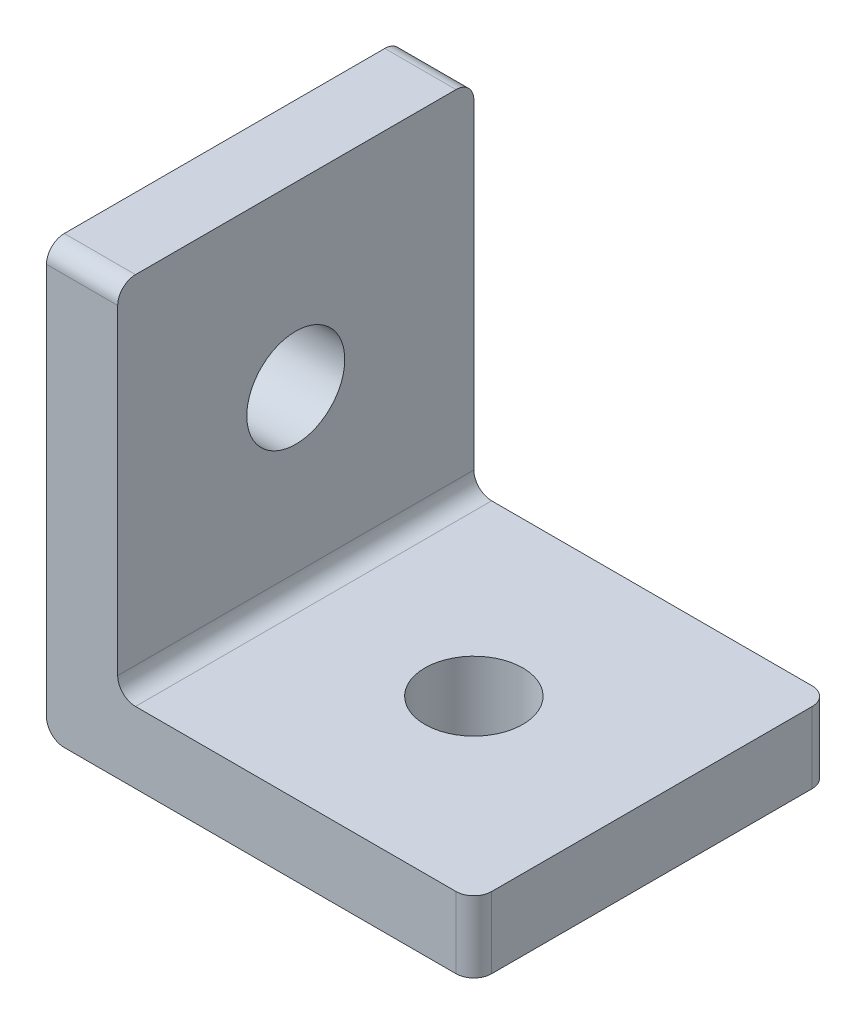
ISO-10303-21;
HEADER;
FILE_DESCRIPTION(('STEP AP214'),'2;1');
FILE_NAME('part.step','',(''),(''),'','','');
FILE_SCHEMA(('AUTOMOTIVE_DESIGN { 1 0 10303 214 1 1 1 1 }'));
ENDSEC;
DATA;
#1=APPLICATION_CONTEXT('core data for automotive mechanical design processes');
#2=APPLICATION_PROTOCOL_DEFINITION('international standard','automotive_design',2000,#1);
#3=PRODUCT_CONTEXT('',#1,'mechanical');
#4=PRODUCT('Part','Part','',(#3));
#5=PRODUCT_RELATED_PRODUCT_CATEGORY('part','',(#4));
#6=PRODUCT_DEFINITION_FORMATION('','',#4);
#7=PRODUCT_DEFINITION_CONTEXT('part definition',#1,'design');
#8=PRODUCT_DEFINITION('design','',#6,#7);
#9=PRODUCT_DEFINITION_SHAPE('','',#8);
#10=(LENGTH_UNIT() NAMED_UNIT(*) SI_UNIT(.MILLI.,.METRE.));
#11=(NAMED_UNIT(*) PLANE_ANGLE_UNIT() SI_UNIT($,.RADIAN.));
#12=(NAMED_UNIT(*) SI_UNIT($,.STERADIAN.) SOLID_ANGLE_UNIT());
#13=UNCERTAINTY_MEASURE_WITH_UNIT(LENGTH_MEASURE(1.E-05),#10,'distance_accuracy_value','');
#14=(GEOMETRIC_REPRESENTATION_CONTEXT(3) GLOBAL_UNCERTAINTY_ASSIGNED_CONTEXT((#13)) GLOBAL_UNIT_ASSIGNED_CONTEXT((#10,
#11,#12)) REPRESENTATION_CONTEXT('',''));
#15=CARTESIAN_POINT('',(0.,0.,0.));
#16=DIRECTION('',(0.,0.,1.));
#17=DIRECTION('',(1.,0.,0.));
#18=AXIS2_PLACEMENT_3D('',#15,#16,#17);
#19=CARTESIAN_POINT('',(24.,0.,20.));
#20=DIRECTION('',(1.,0.,0.));
#21=DIRECTION('',(0.,1.,0.));
#22=AXIS2_PLACEMENT_3D('',#19,#20,#21);
#23=PLANE('',#22);
#24=DIRECTION('',(0.,0.,-1.));
#25=VECTOR('',#24,1.);
#26=CARTESIAN_POINT('',(24.,-3.99999999999997,20.));
#27=LINE('',#26,#25);
#28=CARTESIAN_POINT('',(24.,-3.99999999999997,19.));
#29=VERTEX_POINT('',#28);
#30=CARTESIAN_POINT('',(24.,-3.99999999999997,1.));
#31=VERTEX_POINT('',#30);
#32=EDGE_CURVE('E152',#29,#31,#27,.T.);
#33=ORIENTED_EDGE('',*,*,#32,.T.);
#34=DIRECTION('',(0.,-1.,0.));
#35=VECTOR('',#34,1.);
#36=CARTESIAN_POINT('',(24.,0.,1.));
#37=LINE('',#36,#35);
#38=CARTESIAN_POINT('',(24.,0.,1.));
#39=VERTEX_POINT('',#38);
#40=EDGE_CURVE('E54',#31,#39,#37,.F.);
#41=ORIENTED_EDGE('',*,*,#40,.T.);
#42=DIRECTION('',(0.,0.,-1.));
#43=VECTOR('',#42,1.);
#44=CARTESIAN_POINT('',(24.,0.,20.));
#45=LINE('',#44,#43);
#46=CARTESIAN_POINT('',(24.,0.,19.));
#47=VERTEX_POINT('',#46);
#48=EDGE_CURVE('E161',#47,#39,#45,.T.);
#49=ORIENTED_EDGE('',*,*,#48,.F.);
#50=DIRECTION('',(0.,-1.,0.));
#51=VECTOR('',#50,1.);
#52=CARTESIAN_POINT('',(24.,0.,19.));
#53=LINE('',#52,#51);
#54=EDGE_CURVE('E190',#47,#29,#53,.T.);
#55=ORIENTED_EDGE('',*,*,#54,.T.);
#56=EDGE_LOOP('',(#33,#41,#49,#55));
#57=FACE_BOUND('',#56,.T.);
#58=ADVANCED_FACE('F39',(#57),#23,.T.);
#59=CARTESIAN_POINT('',(0.,0.,20.));
#60=DIRECTION('',(0.,1.,0.));
#61=DIRECTION('',(-1.,0.,0.));
#62=AXIS2_PLACEMENT_3D('',#59,#60,#61);
#63=PLANE('',#62);
#64=CARTESIAN_POINT('',(14.,0.,10.));
#65=DIRECTION('',(0.,1.,0.));
#66=DIRECTION('',(-1.,0.,0.));
#67=AXIS2_PLACEMENT_3D('',#64,#65,#66);
#68=CIRCLE('',#67,2.75);
#69=CARTESIAN_POINT('',(11.25,0.,10.));
#70=VERTEX_POINT('',#69);
#71=EDGE_CURVE('E245',#70,#70,#68,.T.);
#72=ORIENTED_EDGE('',*,*,#71,.F.);
#73=EDGE_LOOP('',(#72));
#74=FACE_BOUND('',#73,.T.);
#75=ORIENTED_EDGE('',*,*,#48,.T.);
#76=CARTESIAN_POINT('',(23.,0.,1.));
#77=DIRECTION('',(0.,1.,0.));
#78=DIRECTION('',(-1.,0.,0.));
#79=AXIS2_PLACEMENT_3D('',#76,#77,#78);
#80=CIRCLE('',#79,1.);
#81=CARTESIAN_POINT('',(23.,0.,0.));
#82=VERTEX_POINT('',#81);
#83=EDGE_CURVE('E197',#39,#82,#80,.T.);
#84=ORIENTED_EDGE('',*,*,#83,.T.);
#85=DIRECTION('',(1.,0.,0.));
#86=VECTOR('',#85,1.);
#87=CARTESIAN_POINT('',(0.,0.,0.));
#88=LINE('',#87,#86);
#89=CARTESIAN_POINT('',(5.,0.,0.));
#90=VERTEX_POINT('',#89);
#91=EDGE_CURVE('E204',#90,#82,#88,.T.);
#92=ORIENTED_EDGE('',*,*,#91,.F.);
#93=DIRECTION('',(0.,0.,-1.));
#94=VECTOR('',#93,1.);
#95=CARTESIAN_POINT('',(5.,0.,20.));
#96=LINE('',#95,#94);
#97=CARTESIAN_POINT('',(5.,0.,20.));
#98=VERTEX_POINT('',#97);
#99=EDGE_CURVE('E194',#90,#98,#96,.F.);
#100=ORIENTED_EDGE('',*,*,#99,.T.);
#101=DIRECTION('',(1.,0.,0.));
#102=VECTOR('',#101,1.);
#103=CARTESIAN_POINT('',(0.,0.,20.));
#104=LINE('',#103,#102);
#105=CARTESIAN_POINT('',(23.,0.,20.));
#106=VERTEX_POINT('',#105);
#107=EDGE_CURVE('E223',#98,#106,#104,.T.);
#108=ORIENTED_EDGE('',*,*,#107,.T.);
#109=CARTESIAN_POINT('',(23.,0.,19.));
#110=DIRECTION('',(0.,1.,0.));
#111=DIRECTION('',(-1.,0.,0.));
#112=AXIS2_PLACEMENT_3D('',#109,#110,#111);
#113=CIRCLE('',#112,1.);
#114=EDGE_CURVE('E61',#106,#47,#113,.T.);
#115=ORIENTED_EDGE('',*,*,#114,.T.);
#116=EDGE_LOOP('',(#75,#84,#92,#100,#108,#115));
#117=FACE_BOUND('',#116,.T.);
#118=ADVANCED_FACE('F211',(#74,#117),#63,.T.);
#119=CARTESIAN_POINT('',(4.,0.,20.));
#120=DIRECTION('',(-1.,0.,0.));
#121=DIRECTION('',(0.,-1.,0.));
#122=AXIS2_PLACEMENT_3D('',#119,#120,#121);
#123=PLANE('',#122);
#124=CARTESIAN_POINT('',(4.,10.,10.));
#125=DIRECTION('',(1.,0.,0.));
#126=DIRECTION('',(0.,1.,0.));
#127=AXIS2_PLACEMENT_3D('',#124,#125,#126);
#128=CIRCLE('',#127,2.75);
#129=CARTESIAN_POINT('',(4.,12.75,10.));
#130=VERTEX_POINT('',#129);
#131=EDGE_CURVE('E248',#130,#130,#128,.T.);
#132=ORIENTED_EDGE('',*,*,#131,.F.);
#133=EDGE_LOOP('',(#132));
#134=FACE_BOUND('',#133,.T.);
#135=DIRECTION('',(0.,0.,-1.));
#136=VECTOR('',#135,1.);
#137=CARTESIAN_POINT('',(4.,20.,20.));
#138=LINE('',#137,#136);
#139=CARTESIAN_POINT('',(4.,20.,19.));
#140=VERTEX_POINT('',#139);
#141=CARTESIAN_POINT('',(4.,20.,1.));
#142=VERTEX_POINT('',#141);
#143=EDGE_CURVE('E151',#140,#142,#138,.T.);
#144=ORIENTED_EDGE('',*,*,#143,.F.);
#145=CARTESIAN_POINT('',(4.,19.,19.));
#146=DIRECTION('',(-1.,0.,0.));
#147=DIRECTION('',(0.,-1.,0.));
#148=AXIS2_PLACEMENT_3D('',#145,#146,#147);
#149=CIRCLE('',#148,1.);
#150=CARTESIAN_POINT('',(4.,19.,20.));
#151=VERTEX_POINT('',#150);
#152=EDGE_CURVE('E155',#140,#151,#149,.F.);
#153=ORIENTED_EDGE('',*,*,#152,.T.);
#154=DIRECTION('',(0.,1.,0.));
#155=VECTOR('',#154,1.);
#156=CARTESIAN_POINT('',(4.,0.,20.));
#157=LINE('',#156,#155);
#158=CARTESIAN_POINT('',(4.,1.00000000000001,20.));
#159=VERTEX_POINT('',#158);
#160=EDGE_CURVE('E222',#159,#151,#157,.T.);
#161=ORIENTED_EDGE('',*,*,#160,.F.);
#162=DIRECTION('',(0.,0.,-1.));
#163=VECTOR('',#162,1.);
#164=CARTESIAN_POINT('',(4.,1.00000000000001,20.));
#165=LINE('',#164,#163);
#166=CARTESIAN_POINT('',(4.,1.00000000000001,0.));
#167=VERTEX_POINT('',#166);
#168=EDGE_CURVE('E156',#159,#167,#165,.T.);
#169=ORIENTED_EDGE('',*,*,#168,.T.);
#170=DIRECTION('',(0.,1.,0.));
#171=VECTOR('',#170,1.);
#172=CARTESIAN_POINT('',(4.,0.,0.));
#173=LINE('',#172,#171);
#174=CARTESIAN_POINT('',(4.,19.,0.));
#175=VERTEX_POINT('',#174);
#176=EDGE_CURVE('E207',#167,#175,#173,.T.);
#177=ORIENTED_EDGE('',*,*,#176,.T.);
#178=CARTESIAN_POINT('',(4.,19.,1.));
#179=DIRECTION('',(-1.,0.,0.));
#180=DIRECTION('',(0.,-1.,0.));
#181=AXIS2_PLACEMENT_3D('',#178,#179,#180);
#182=CIRCLE('',#181,1.);
#183=EDGE_CURVE('E159',#175,#142,#182,.F.);
#184=ORIENTED_EDGE('',*,*,#183,.T.);
#185=EDGE_LOOP('',(#144,#153,#161,#169,#177,#184));
#186=FACE_BOUND('',#185,.T.);
#187=ADVANCED_FACE('F225',(#134,#186),#123,.F.);
#188=CARTESIAN_POINT('',(0.,20.,20.));
#189=DIRECTION('',(0.,1.,0.));
#190=DIRECTION('',(0.,0.,1.));
#191=AXIS2_PLACEMENT_3D('',#188,#189,#190);
#192=PLANE('',#191);
#193=DIRECTION('',(0.,0.,-1.));
#194=VECTOR('',#193,1.);
#195=CARTESIAN_POINT('',(0.,20.,20.));
#196=LINE('',#195,#194);
#197=CARTESIAN_POINT('',(0.,20.,19.));
#198=VERTEX_POINT('',#197);
#199=CARTESIAN_POINT('',(0.,20.,1.));
#200=VERTEX_POINT('',#199);
#201=EDGE_CURVE('E133',#198,#200,#196,.T.);
#202=ORIENTED_EDGE('',*,*,#201,.F.);
#203=DIRECTION('',(1.,0.,0.));
#204=VECTOR('',#203,1.);
#205=CARTESIAN_POINT('',(0.,20.,19.));
#206=LINE('',#205,#204);
#207=EDGE_CURVE('E147',#198,#140,#206,.T.);
#208=ORIENTED_EDGE('',*,*,#207,.T.);
#209=ORIENTED_EDGE('',*,*,#143,.T.);
#210=DIRECTION('',(1.,0.,0.));
#211=VECTOR('',#210,1.);
#212=CARTESIAN_POINT('',(0.,20.,1.));
#213=LINE('',#212,#211);
#214=EDGE_CURVE('E150',#142,#200,#213,.F.);
#215=ORIENTED_EDGE('',*,*,#214,.T.);
#216=EDGE_LOOP('',(#202,#208,#209,#215));
#217=FACE_BOUND('',#216,.T.);
#218=ADVANCED_FACE('F145',(#217),#192,.T.);
#219=CARTESIAN_POINT('',(0.,0.,20.));
#220=DIRECTION('',(1.,0.,0.));
#221=DIRECTION('',(0.,1.,0.));
#222=AXIS2_PLACEMENT_3D('',#219,#220,#221);
#223=PLANE('',#222);
#224=CARTESIAN_POINT('',(0.,10.,10.));
#225=DIRECTION('',(1.,0.,0.));
#226=DIRECTION('',(0.,1.,0.));
#227=AXIS2_PLACEMENT_3D('',#224,#225,#226);
#228=CIRCLE('',#227,2.75);
#229=CARTESIAN_POINT('',(0.,12.75,10.));
#230=VERTEX_POINT('',#229);
#231=EDGE_CURVE('E246',#230,#230,#228,.T.);
#232=ORIENTED_EDGE('',*,*,#231,.T.);
#233=EDGE_LOOP('',(#232));
#234=FACE_BOUND('',#233,.T.);
#235=DIRECTION('',(0.,-1.,0.));
#236=VECTOR('',#235,1.);
#237=CARTESIAN_POINT('',(0.,0.,20.));
#238=LINE('',#237,#236);
#239=CARTESIAN_POINT('',(0.,19.,20.));
#240=VERTEX_POINT('',#239);
#241=CARTESIAN_POINT('',(0.,-3.,20.));
#242=VERTEX_POINT('',#241);
#243=EDGE_CURVE('E136',#240,#242,#238,.T.);
#244=ORIENTED_EDGE('',*,*,#243,.F.);
#245=CARTESIAN_POINT('',(0.,19.,19.));
#246=DIRECTION('',(1.,0.,0.));
#247=DIRECTION('',(0.,1.,0.));
#248=AXIS2_PLACEMENT_3D('',#245,#246,#247);
#249=CIRCLE('',#248,1.);
#250=EDGE_CURVE('E130',#240,#198,#249,.F.);
#251=ORIENTED_EDGE('',*,*,#250,.T.);
#252=ORIENTED_EDGE('',*,*,#201,.T.);
#253=CARTESIAN_POINT('',(0.,19.,1.));
#254=DIRECTION('',(1.,0.,0.));
#255=DIRECTION('',(0.,1.,0.));
#256=AXIS2_PLACEMENT_3D('',#253,#254,#255);
#257=CIRCLE('',#256,1.);
#258=CARTESIAN_POINT('',(0.,19.,0.));
#259=VERTEX_POINT('',#258);
#260=EDGE_CURVE('E141',#200,#259,#257,.F.);
#261=ORIENTED_EDGE('',*,*,#260,.T.);
#262=DIRECTION('',(0.,-1.,0.));
#263=VECTOR('',#262,1.);
#264=CARTESIAN_POINT('',(0.,0.,0.));
#265=LINE('',#264,#263);
#266=CARTESIAN_POINT('',(0.,-3.,0.));
#267=VERTEX_POINT('',#266);
#268=EDGE_CURVE('E236',#259,#267,#265,.T.);
#269=ORIENTED_EDGE('',*,*,#268,.T.);
#270=DIRECTION('',(0.,0.,-1.));
#271=VECTOR('',#270,1.);
#272=CARTESIAN_POINT('',(0.,-3.,20.));
#273=LINE('',#272,#271);
#274=EDGE_CURVE('E173',#267,#242,#273,.F.);
#275=ORIENTED_EDGE('',*,*,#274,.T.);
#276=EDGE_LOOP('',(#244,#251,#252,#261,#269,#275));
#277=FACE_BOUND('',#276,.T.);
#278=ADVANCED_FACE('F132',(#234,#277),#223,.F.);
#279=CARTESIAN_POINT('',(0.,-4.,20.));
#280=DIRECTION('',(0.,1.,0.));
#281=DIRECTION('',(-1.,0.,0.));
#282=AXIS2_PLACEMENT_3D('',#279,#280,#281);
#283=PLANE('',#282);
#284=CARTESIAN_POINT('',(14.,-3.99999999999998,10.));
#285=DIRECTION('',(0.,1.,0.));
#286=DIRECTION('',(-1.,0.,0.));
#287=AXIS2_PLACEMENT_3D('',#284,#285,#286);
#288=CIRCLE('',#287,2.75);
#289=CARTESIAN_POINT('',(11.25,-3.99999999999999,10.));
#290=VERTEX_POINT('',#289);
#291=EDGE_CURVE('E214',#290,#290,#288,.T.);
#292=ORIENTED_EDGE('',*,*,#291,.T.);
#293=EDGE_LOOP('',(#292));
#294=FACE_BOUND('',#293,.T.);
#295=DIRECTION('',(1.,0.,0.));
#296=VECTOR('',#295,1.);
#297=CARTESIAN_POINT('',(0.,-4.,0.));
#298=LINE('',#297,#296);
#299=CARTESIAN_POINT('',(1.,-4.,0.));
#300=VERTEX_POINT('',#299);
#301=CARTESIAN_POINT('',(23.,-3.99999999999997,0.));
#302=VERTEX_POINT('',#301);
#303=EDGE_CURVE('E229',#300,#302,#298,.T.);
#304=ORIENTED_EDGE('',*,*,#303,.T.);
#305=CARTESIAN_POINT('',(23.,-3.99999999999997,1.));
#306=DIRECTION('',(0.,1.,0.));
#307=DIRECTION('',(-1.,0.,0.));
#308=AXIS2_PLACEMENT_3D('',#305,#306,#307);
#309=CIRCLE('',#308,1.);
#310=EDGE_CURVE('E188',#302,#31,#309,.F.);
#311=ORIENTED_EDGE('',*,*,#310,.T.);
#312=ORIENTED_EDGE('',*,*,#32,.F.);
#313=CARTESIAN_POINT('',(23.,-3.99999999999997,19.));
#314=DIRECTION('',(0.,1.,0.));
#315=DIRECTION('',(-1.,0.,0.));
#316=AXIS2_PLACEMENT_3D('',#313,#314,#315);
#317=CIRCLE('',#316,1.);
#318=CARTESIAN_POINT('',(23.,-3.99999999999997,20.));
#319=VERTEX_POINT('',#318);
#320=EDGE_CURVE('E186',#29,#319,#317,.F.);
#321=ORIENTED_EDGE('',*,*,#320,.T.);
#322=DIRECTION('',(1.,0.,0.));
#323=VECTOR('',#322,1.);
#324=CARTESIAN_POINT('',(0.,-4.,20.));
#325=LINE('',#324,#323);
#326=CARTESIAN_POINT('',(1.,-4.,20.));
#327=VERTEX_POINT('',#326);
#328=EDGE_CURVE('E227',#327,#319,#325,.T.);
#329=ORIENTED_EDGE('',*,*,#328,.F.);
#330=DIRECTION('',(0.,0.,-1.));
#331=VECTOR('',#330,1.);
#332=CARTESIAN_POINT('',(1.,-4.,20.));
#333=LINE('',#332,#331);
#334=EDGE_CURVE('E183',#327,#300,#333,.T.);
#335=ORIENTED_EDGE('',*,*,#334,.T.);
#336=EDGE_LOOP('',(#304,#311,#312,#321,#329,#335));
#337=FACE_BOUND('',#336,.T.);
#338=ADVANCED_FACE('F299',(#294,#337),#283,.F.);
#339=CARTESIAN_POINT('',(0.,0.,20.));
#340=DIRECTION('',(0.,0.,1.));
#341=DIRECTION('',(1.,0.,0.));
#342=AXIS2_PLACEMENT_3D('',#339,#340,#341);
#343=PLANE('',#342);
#344=ORIENTED_EDGE('',*,*,#160,.T.);
#345=DIRECTION('',(1.,0.,0.));
#346=VECTOR('',#345,1.);
#347=CARTESIAN_POINT('',(0.,19.,20.));
#348=LINE('',#347,#346);
#349=EDGE_CURVE('E171',#151,#240,#348,.F.);
#350=ORIENTED_EDGE('',*,*,#349,.T.);
#351=ORIENTED_EDGE('',*,*,#243,.T.);
#352=CARTESIAN_POINT('',(1.,-3.,20.));
#353=DIRECTION('',(0.,0.,1.));
#354=DIRECTION('',(1.,0.,0.));
#355=AXIS2_PLACEMENT_3D('',#352,#353,#354);
#356=CIRCLE('',#355,1.);
#357=EDGE_CURVE('E167',#242,#327,#356,.T.);
#358=ORIENTED_EDGE('',*,*,#357,.T.);
#359=ORIENTED_EDGE('',*,*,#328,.T.);
#360=DIRECTION('',(0.,-1.,0.));
#361=VECTOR('',#360,1.);
#362=CARTESIAN_POINT('',(23.,0.,20.));
#363=LINE('',#362,#361);
#364=EDGE_CURVE('E169',#319,#106,#363,.F.);
#365=ORIENTED_EDGE('',*,*,#364,.T.);
#366=ORIENTED_EDGE('',*,*,#107,.F.);
#367=CARTESIAN_POINT('',(5.,1.00000000000001,20.));
#368=DIRECTION('',(0.,0.,1.));
#369=DIRECTION('',(1.,0.,0.));
#370=AXIS2_PLACEMENT_3D('',#367,#368,#369);
#371=CIRCLE('',#370,1.);
#372=EDGE_CURVE('E11',#98,#159,#371,.F.);
#373=ORIENTED_EDGE('',*,*,#372,.T.);
#374=EDGE_LOOP('',(#344,#350,#351,#358,#359,#365,#366,#373));
#375=FACE_BOUND('',#374,.T.);
#376=ADVANCED_FACE('F221',(#375),#343,.T.);
#377=CARTESIAN_POINT('',(0.,0.,0.));
#378=DIRECTION('',(0.,0.,1.));
#379=DIRECTION('',(1.,0.,0.));
#380=AXIS2_PLACEMENT_3D('',#377,#378,#379);
#381=PLANE('',#380);
#382=ORIENTED_EDGE('',*,*,#268,.F.);
#383=DIRECTION('',(1.,0.,0.));
#384=VECTOR('',#383,1.);
#385=CARTESIAN_POINT('',(4.,19.,0.));
#386=LINE('',#385,#384);
#387=EDGE_CURVE('E180',#259,#175,#386,.T.);
#388=ORIENTED_EDGE('',*,*,#387,.T.);
#389=ORIENTED_EDGE('',*,*,#176,.F.);
#390=CARTESIAN_POINT('',(5.,1.00000000000001,0.));
#391=DIRECTION('',(0.,0.,1.));
#392=DIRECTION('',(1.,0.,0.));
#393=AXIS2_PLACEMENT_3D('',#390,#391,#392);
#394=CIRCLE('',#393,1.);
#395=EDGE_CURVE('E47',#167,#90,#394,.T.);
#396=ORIENTED_EDGE('',*,*,#395,.T.);
#397=ORIENTED_EDGE('',*,*,#91,.T.);
#398=DIRECTION('',(0.,-1.,0.));
#399=VECTOR('',#398,1.);
#400=CARTESIAN_POINT('',(23.,-3.99999999999997,0.));
#401=LINE('',#400,#399);
#402=EDGE_CURVE('E177',#82,#302,#401,.T.);
#403=ORIENTED_EDGE('',*,*,#402,.T.);
#404=ORIENTED_EDGE('',*,*,#303,.F.);
#405=CARTESIAN_POINT('',(1.,-3.,0.));
#406=DIRECTION('',(0.,0.,1.));
#407=DIRECTION('',(1.,0.,0.));
#408=AXIS2_PLACEMENT_3D('',#405,#406,#407);
#409=CIRCLE('',#408,1.);
#410=EDGE_CURVE('E140',#300,#267,#409,.F.);
#411=ORIENTED_EDGE('',*,*,#410,.T.);
#412=EDGE_LOOP('',(#382,#388,#389,#396,#397,#403,#404,#411));
#413=FACE_BOUND('',#412,.T.);
#414=ADVANCED_FACE('F203',(#413),#381,.F.);
#415=CARTESIAN_POINT('',(14.,-20.,10.));
#416=DIRECTION('',(0.,1.,0.));
#417=DIRECTION('',(-1.,0.,0.));
#418=AXIS2_PLACEMENT_3D('',#415,#416,#417);
#419=CYLINDRICAL_SURFACE('',#418,2.75);
#420=ORIENTED_EDGE('',*,*,#71,.T.);
#421=EDGE_LOOP('',(#420));
#422=FACE_BOUND('',#421,.T.);
#423=ORIENTED_EDGE('',*,*,#291,.F.);
#424=EDGE_LOOP('',(#423));
#425=FACE_BOUND('',#424,.T.);
#426=ADVANCED_FACE('F315',(#422,#425),#419,.F.);
#427=CARTESIAN_POINT('',(-16.,10.,10.));
#428=DIRECTION('',(1.,0.,0.));
#429=DIRECTION('',(0.,1.,0.));
#430=AXIS2_PLACEMENT_3D('',#427,#428,#429);
#431=CYLINDRICAL_SURFACE('',#430,2.75);
#432=ORIENTED_EDGE('',*,*,#131,.T.);
#433=EDGE_LOOP('',(#432));
#434=FACE_BOUND('',#433,.T.);
#435=ORIENTED_EDGE('',*,*,#231,.F.);
#436=EDGE_LOOP('',(#435));
#437=FACE_BOUND('',#436,.T.);
#438=ADVANCED_FACE('F256',(#434,#437),#431,.F.);
#439=CARTESIAN_POINT('',(0.,19.,19.));
#440=DIRECTION('',(1.,0.,0.));
#441=DIRECTION('',(0.,0.,-1.));
#442=AXIS2_PLACEMENT_3D('',#439,#440,#441);
#443=CYLINDRICAL_SURFACE('',#442,1.);
#444=ORIENTED_EDGE('',*,*,#250,.F.);
#445=ORIENTED_EDGE('',*,*,#349,.F.);
#446=ORIENTED_EDGE('',*,*,#152,.F.);
#447=ORIENTED_EDGE('',*,*,#207,.F.);
#448=EDGE_LOOP('',(#444,#445,#446,#447));
#449=FACE_BOUND('',#448,.T.);
#450=ADVANCED_FACE('F154',(#449),#443,.T.);
#451=CARTESIAN_POINT('',(0.,19.,1.));
#452=DIRECTION('',(-1.,0.,0.));
#453=DIRECTION('',(0.,0.,1.));
#454=AXIS2_PLACEMENT_3D('',#451,#452,#453);
#455=CYLINDRICAL_SURFACE('',#454,1.);
#456=ORIENTED_EDGE('',*,*,#260,.F.);
#457=ORIENTED_EDGE('',*,*,#214,.F.);
#458=ORIENTED_EDGE('',*,*,#183,.F.);
#459=ORIENTED_EDGE('',*,*,#387,.F.);
#460=EDGE_LOOP('',(#456,#457,#458,#459));
#461=FACE_BOUND('',#460,.T.);
#462=ADVANCED_FACE('F275',(#461),#455,.T.);
#463=CARTESIAN_POINT('',(23.,0.,1.));
#464=DIRECTION('',(0.,1.,0.));
#465=DIRECTION('',(-1.,0.,0.));
#466=AXIS2_PLACEMENT_3D('',#463,#464,#465);
#467=CYLINDRICAL_SURFACE('',#466,1.);
#468=ORIENTED_EDGE('',*,*,#83,.F.);
#469=ORIENTED_EDGE('',*,*,#40,.F.);
#470=ORIENTED_EDGE('',*,*,#310,.F.);
#471=ORIENTED_EDGE('',*,*,#402,.F.);
#472=EDGE_LOOP('',(#468,#469,#470,#471));
#473=FACE_BOUND('',#472,.T.);
#474=ADVANCED_FACE('F278',(#473),#467,.T.);
#475=CARTESIAN_POINT('',(23.,0.,19.));
#476=DIRECTION('',(0.,-1.,0.));
#477=DIRECTION('',(1.,0.,0.));
#478=AXIS2_PLACEMENT_3D('',#475,#476,#477);
#479=CYLINDRICAL_SURFACE('',#478,1.);
#480=ORIENTED_EDGE('',*,*,#114,.F.);
#481=ORIENTED_EDGE('',*,*,#364,.F.);
#482=ORIENTED_EDGE('',*,*,#320,.F.);
#483=ORIENTED_EDGE('',*,*,#54,.F.);
#484=EDGE_LOOP('',(#480,#481,#482,#483));
#485=FACE_BOUND('',#484,.T.);
#486=ADVANCED_FACE('F282',(#485),#479,.T.);
#487=CARTESIAN_POINT('',(5.,1.00000000000001,20.));
#488=DIRECTION('',(0.,0.,-1.));
#489=DIRECTION('',(-1.,0.,0.));
#490=AXIS2_PLACEMENT_3D('',#487,#488,#489);
#491=CYLINDRICAL_SURFACE('',#490,1.);
#492=ORIENTED_EDGE('',*,*,#372,.F.);
#493=ORIENTED_EDGE('',*,*,#99,.F.);
#494=ORIENTED_EDGE('',*,*,#395,.F.);
#495=ORIENTED_EDGE('',*,*,#168,.F.);
#496=EDGE_LOOP('',(#492,#493,#494,#495));
#497=FACE_BOUND('',#496,.T.);
#498=ADVANCED_FACE('F217',(#497),#491,.F.);
#499=CARTESIAN_POINT('',(1.,-3.,20.));
#500=DIRECTION('',(0.,0.,-1.));
#501=DIRECTION('',(-1.,0.,0.));
#502=AXIS2_PLACEMENT_3D('',#499,#500,#501);
#503=CYLINDRICAL_SURFACE('',#502,1.);
#504=ORIENTED_EDGE('',*,*,#357,.F.);
#505=ORIENTED_EDGE('',*,*,#274,.F.);
#506=ORIENTED_EDGE('',*,*,#410,.F.);
#507=ORIENTED_EDGE('',*,*,#334,.F.);
#508=EDGE_LOOP('',(#504,#505,#506,#507));
#509=FACE_BOUND('',#508,.T.);
#510=ADVANCED_FACE('F41',(#509),#503,.T.);
#511=CLOSED_SHELL('',(#58,#118,#187,#218,#278,#338,#376,#414,#426,#438,#450,#462,#474,#486,#498,#510));
#512=MANIFOLD_SOLID_BREP('B2',#511);
#513=ADVANCED_BREP_SHAPE_REPRESENTATION('',(#18,#512),#14);
#514=SHAPE_DEFINITION_REPRESENTATION(#9,#513);
ENDSEC;
END-ISO-10303-21;
